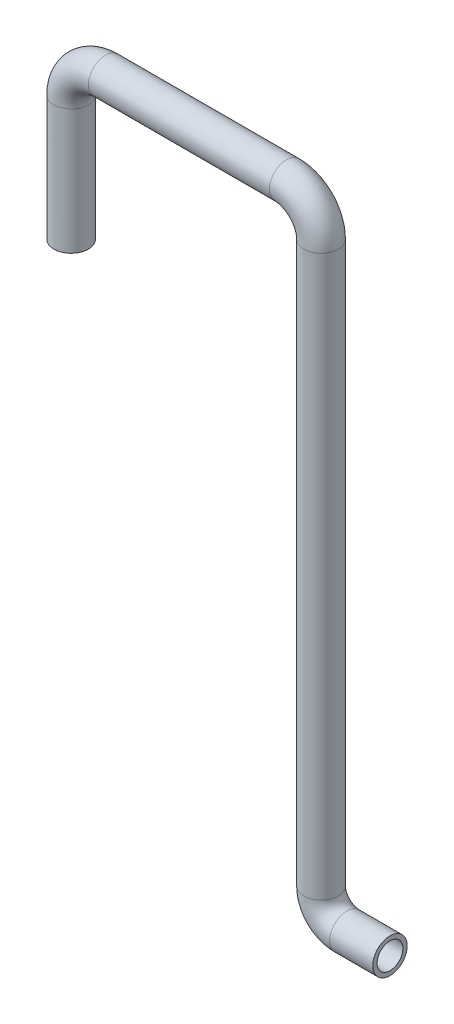
ISO-10303-21;
HEADER;
FILE_DESCRIPTION(('STEP AP214'),'2;1');
FILE_NAME('part.step','',(''),(''),'','','');
FILE_SCHEMA(('AUTOMOTIVE_DESIGN { 1 0 10303 214 1 1 1 1 }'));
ENDSEC;
DATA;
#1=APPLICATION_CONTEXT('core data for automotive mechanical design processes');
#2=APPLICATION_PROTOCOL_DEFINITION('international standard','automotive_design',2000,#1);
#3=PRODUCT_CONTEXT('',#1,'mechanical');
#4=PRODUCT('Part','Part','',(#3));
#5=PRODUCT_RELATED_PRODUCT_CATEGORY('part','',(#4));
#6=PRODUCT_DEFINITION_FORMATION('','',#4);
#7=PRODUCT_DEFINITION_CONTEXT('part definition',#1,'design');
#8=PRODUCT_DEFINITION('design','',#6,#7);
#9=PRODUCT_DEFINITION_SHAPE('','',#8);
#10=(LENGTH_UNIT() NAMED_UNIT(*) SI_UNIT(.MILLI.,.METRE.));
#11=(NAMED_UNIT(*) PLANE_ANGLE_UNIT() SI_UNIT($,.RADIAN.));
#12=(NAMED_UNIT(*) SI_UNIT($,.STERADIAN.) SOLID_ANGLE_UNIT());
#13=UNCERTAINTY_MEASURE_WITH_UNIT(LENGTH_MEASURE(1.E-05),#10,'distance_accuracy_value','');
#14=(GEOMETRIC_REPRESENTATION_CONTEXT(3) GLOBAL_UNCERTAINTY_ASSIGNED_CONTEXT((#13)) GLOBAL_UNIT_ASSIGNED_CONTEXT((#10,
#11,#12)) REPRESENTATION_CONTEXT('',''));
#15=CARTESIAN_POINT('',(0.,0.,0.));
#16=DIRECTION('',(0.,0.,1.));
#17=DIRECTION('',(1.,0.,0.));
#18=AXIS2_PLACEMENT_3D('',#15,#16,#17);
#19=CARTESIAN_POINT('',(14.,128.,95.));
#20=DIRECTION('',(0.,-1.,0.));
#21=DIRECTION('',(0.,0.,1.));
#22=AXIS2_PLACEMENT_3D('',#19,#20,#21);
#23=PLANE('',#22);
#24=CARTESIAN_POINT('',(14.,128.,95.));
#25=DIRECTION('',(0.,-1.,0.));
#26=DIRECTION('',(0.,0.,1.));
#27=AXIS2_PLACEMENT_3D('',#24,#25,#26);
#28=CIRCLE('',#27,3.);
#29=CARTESIAN_POINT('',(14.,128.,98.));
#30=VERTEX_POINT('',#29);
#31=EDGE_CURVE('E263',#30,#30,#28,.T.);
#32=ORIENTED_EDGE('',*,*,#31,.F.);
#33=EDGE_LOOP('',(#32));
#34=FACE_BOUND('',#33,.T.);
#35=CARTESIAN_POINT('',(14.,128.,95.));
#36=DIRECTION('',(0.,-1.,0.));
#37=DIRECTION('',(1.,0.,0.));
#38=AXIS2_PLACEMENT_3D('',#35,#36,#37);
#39=CIRCLE('',#38,4.);
#40=CARTESIAN_POINT('',(18.,128.,95.));
#41=VERTEX_POINT('',#40);
#42=EDGE_CURVE('E75',#41,#41,#39,.T.);
#43=ORIENTED_EDGE('',*,*,#42,.T.);
#44=EDGE_LOOP('',(#43));
#45=FACE_BOUND('',#44,.T.);
#46=ADVANCED_FACE('F52',(#34,#45),#23,.T.);
#47=CARTESIAN_POINT('',(88.,21.,95.));
#48=DIRECTION('',(-1.,0.,0.));
#49=DIRECTION('',(0.,0.,1.));
#50=AXIS2_PLACEMENT_3D('',#47,#48,#49);
#51=PLANE('',#50);
#52=CARTESIAN_POINT('',(88.,21.,95.));
#53=DIRECTION('',(-1.,0.,0.));
#54=DIRECTION('',(0.,0.,1.));
#55=AXIS2_PLACEMENT_3D('',#52,#53,#54);
#56=CIRCLE('',#55,3.);
#57=CARTESIAN_POINT('',(88.,21.,98.));
#58=VERTEX_POINT('',#57);
#59=EDGE_CURVE('E73',#58,#58,#56,.T.);
#60=ORIENTED_EDGE('',*,*,#59,.T.);
#61=EDGE_LOOP('',(#60));
#62=FACE_BOUND('',#61,.T.);
#63=CARTESIAN_POINT('',(88.,21.,95.));
#64=DIRECTION('',(-1.,0.,0.));
#65=DIRECTION('',(0.,0.,1.));
#66=AXIS2_PLACEMENT_3D('',#63,#64,#65);
#67=CIRCLE('',#66,4.);
#68=CARTESIAN_POINT('',(88.,21.,99.));
#69=VERTEX_POINT('',#68);
#70=EDGE_CURVE('E11',#69,#69,#67,.T.);
#71=ORIENTED_EDGE('',*,*,#70,.F.);
#72=EDGE_LOOP('',(#71));
#73=FACE_BOUND('',#72,.T.);
#74=ADVANCED_FACE('F149',(#62,#73),#51,.F.);
#75=CARTESIAN_POINT('',(14.,128.,95.));
#76=DIRECTION('',(0.,1.,0.));
#77=DIRECTION('',(-1.,0.,0.));
#78=AXIS2_PLACEMENT_3D('',#75,#76,#77);
#79=CYLINDRICAL_SURFACE('',#78,4.);
#80=CARTESIAN_POINT('',(14.,157.,95.));
#81=DIRECTION('',(0.,1.,0.));
#82=DIRECTION('',(-1.,0.,0.));
#83=AXIS2_PLACEMENT_3D('',#80,#81,#82);
#84=CIRCLE('',#83,4.);
#85=CARTESIAN_POINT('',(9.99999999999999,157.,95.));
#86=VERTEX_POINT('',#85);
#87=EDGE_CURVE('E74',#86,#86,#84,.F.);
#88=ORIENTED_EDGE('',*,*,#87,.T.);
#89=EDGE_LOOP('',(#88));
#90=FACE_BOUND('',#89,.T.);
#91=ORIENTED_EDGE('',*,*,#42,.F.);
#92=EDGE_LOOP('',(#91));
#93=FACE_BOUND('',#92,.T.);
#94=ADVANCED_FACE('F155',(#90,#93),#79,.T.);
#95=CARTESIAN_POINT('',(22.,157.,95.));
#96=DIRECTION('',(0.,0.,-1.));
#97=DIRECTION('',(-1.,0.,0.));
#98=AXIS2_PLACEMENT_3D('',#95,#96,#97);
#99=TOROIDAL_SURFACE('',#98,8.,4.);
#100=CARTESIAN_POINT('',(22.,165.,95.));
#101=DIRECTION('',(-1.,0.,0.));
#102=DIRECTION('',(0.,-1.,0.));
#103=AXIS2_PLACEMENT_3D('',#100,#101,#102);
#104=CIRCLE('',#103,4.);
#105=CARTESIAN_POINT('',(22.,169.,95.));
#106=VERTEX_POINT('',#105);
#107=EDGE_CURVE('E78',#106,#106,#104,.T.);
#108=CARTESIAN_POINT('',(22.,157.,95.));
#109=DIRECTION('',(0.,0.,-1.));
#110=DIRECTION('',(-1.,0.,0.));
#111=AXIS2_PLACEMENT_3D('',#108,#109,#110);
#112=CIRCLE('',#111,12.);
#113=EDGE_CURVE('',#86,#106,#112,.T.);
#114=ORIENTED_EDGE('',*,*,#87,.F.);
#115=ORIENTED_EDGE('',*,*,#107,.T.);
#116=ORIENTED_EDGE('',*,*,#113,.T.);
#117=ORIENTED_EDGE('',*,*,#113,.F.);
#118=EDGE_LOOP('',(#114,#116,#115,#117));
#119=FACE_BOUND('',#118,.T.);
#120=ADVANCED_FACE('F158',(#119),#99,.T.);
#121=CARTESIAN_POINT('',(22.,165.,95.));
#122=DIRECTION('',(1.,0.,0.));
#123=DIRECTION('',(0.,0.,-1.));
#124=AXIS2_PLACEMENT_3D('',#121,#122,#123);
#125=CYLINDRICAL_SURFACE('',#124,4.);
#126=CARTESIAN_POINT('',(64.,165.,95.));
#127=DIRECTION('',(1.,0.,0.));
#128=DIRECTION('',(0.,0.,-1.));
#129=AXIS2_PLACEMENT_3D('',#126,#127,#128);
#130=CIRCLE('',#129,4.);
#131=CARTESIAN_POINT('',(64.,169.,95.));
#132=VERTEX_POINT('',#131);
#133=EDGE_CURVE('E91',#132,#132,#130,.F.);
#134=ORIENTED_EDGE('',*,*,#133,.T.);
#135=EDGE_LOOP('',(#134));
#136=FACE_BOUND('',#135,.T.);
#137=ORIENTED_EDGE('',*,*,#107,.F.);
#138=EDGE_LOOP('',(#137));
#139=FACE_BOUND('',#138,.T.);
#140=ADVANCED_FACE('F109',(#136,#139),#125,.T.);
#141=CARTESIAN_POINT('',(64.,157.,95.));
#142=DIRECTION('',(0.,0.,-1.));
#143=DIRECTION('',(-1.,0.,0.));
#144=AXIS2_PLACEMENT_3D('',#141,#142,#143);
#145=TOROIDAL_SURFACE('',#144,8.00000000000001,4.);
#146=CARTESIAN_POINT('',(72.,157.,95.));
#147=DIRECTION('',(0.,1.,0.));
#148=DIRECTION('',(-1.,0.,0.));
#149=AXIS2_PLACEMENT_3D('',#146,#147,#148);
#150=CIRCLE('',#149,4.);
#151=CARTESIAN_POINT('',(76.,157.,95.));
#152=VERTEX_POINT('',#151);
#153=EDGE_CURVE('E68',#152,#152,#150,.T.);
#154=CARTESIAN_POINT('',(64.,157.,95.));
#155=DIRECTION('',(0.,0.,-1.));
#156=DIRECTION('',(-1.,0.,0.));
#157=AXIS2_PLACEMENT_3D('',#154,#155,#156);
#158=CIRCLE('',#157,12.);
#159=EDGE_CURVE('',#132,#152,#158,.T.);
#160=ORIENTED_EDGE('',*,*,#133,.F.);
#161=ORIENTED_EDGE('',*,*,#153,.T.);
#162=ORIENTED_EDGE('',*,*,#159,.T.);
#163=ORIENTED_EDGE('',*,*,#159,.F.);
#164=EDGE_LOOP('',(#160,#162,#161,#163));
#165=FACE_BOUND('',#164,.T.);
#166=ADVANCED_FACE('F98',(#165),#145,.T.);
#167=CARTESIAN_POINT('',(72.,157.,95.));
#168=DIRECTION('',(0.,-1.,0.));
#169=DIRECTION('',(0.,0.,-1.));
#170=AXIS2_PLACEMENT_3D('',#167,#168,#169);
#171=CYLINDRICAL_SURFACE('',#170,4.);
#172=CARTESIAN_POINT('',(72.,27.,95.));
#173=DIRECTION('',(0.,-1.,0.));
#174=DIRECTION('',(0.,0.,-1.));
#175=AXIS2_PLACEMENT_3D('',#172,#173,#174);
#176=CIRCLE('',#175,4.);
#177=CARTESIAN_POINT('',(68.,27.,95.));
#178=VERTEX_POINT('',#177);
#179=EDGE_CURVE('E63',#178,#178,#176,.F.);
#180=ORIENTED_EDGE('',*,*,#179,.T.);
#181=EDGE_LOOP('',(#180));
#182=FACE_BOUND('',#181,.T.);
#183=ORIENTED_EDGE('',*,*,#153,.F.);
#184=EDGE_LOOP('',(#183));
#185=FACE_BOUND('',#184,.T.);
#186=ADVANCED_FACE('F101',(#182,#185),#171,.T.);
#187=CARTESIAN_POINT('',(78.,27.,95.));
#188=DIRECTION('',(0.,0.,1.));
#189=DIRECTION('',(1.,0.,0.));
#190=AXIS2_PLACEMENT_3D('',#187,#188,#189);
#191=TOROIDAL_SURFACE('',#190,6.00000000000001,4.);
#192=CARTESIAN_POINT('',(78.,21.,95.));
#193=DIRECTION('',(-1.,0.,0.));
#194=DIRECTION('',(0.,-1.,0.));
#195=AXIS2_PLACEMENT_3D('',#192,#193,#194);
#196=CIRCLE('',#195,4.);
#197=CARTESIAN_POINT('',(77.9999999999999,17.,95.));
#198=VERTEX_POINT('',#197);
#199=EDGE_CURVE('E58',#198,#198,#196,.T.);
#200=CARTESIAN_POINT('',(78.,27.,95.));
#201=DIRECTION('',(0.,0.,1.));
#202=DIRECTION('',(1.,0.,0.));
#203=AXIS2_PLACEMENT_3D('',#200,#201,#202);
#204=CIRCLE('',#203,10.);
#205=EDGE_CURVE('',#178,#198,#204,.T.);
#206=ORIENTED_EDGE('',*,*,#179,.F.);
#207=ORIENTED_EDGE('',*,*,#199,.T.);
#208=ORIENTED_EDGE('',*,*,#205,.T.);
#209=ORIENTED_EDGE('',*,*,#205,.F.);
#210=EDGE_LOOP('',(#206,#208,#207,#209));
#211=FACE_BOUND('',#210,.T.);
#212=ADVANCED_FACE('F103',(#211),#191,.T.);
#213=CARTESIAN_POINT('',(78.,21.,95.));
#214=DIRECTION('',(1.,0.,0.));
#215=DIRECTION('',(0.,0.,-1.));
#216=AXIS2_PLACEMENT_3D('',#213,#214,#215);
#217=CYLINDRICAL_SURFACE('',#216,4.);
#218=ORIENTED_EDGE('',*,*,#70,.T.);
#219=EDGE_LOOP('',(#218));
#220=FACE_BOUND('',#219,.T.);
#221=ORIENTED_EDGE('',*,*,#199,.F.);
#222=EDGE_LOOP('',(#221));
#223=FACE_BOUND('',#222,.T.);
#224=ADVANCED_FACE('F54',(#220,#223),#217,.T.);
#225=CARTESIAN_POINT('',(14.,128.,95.));
#226=DIRECTION('',(0.,1.,0.));
#227=DIRECTION('',(-1.,0.,0.));
#228=AXIS2_PLACEMENT_3D('',#225,#226,#227);
#229=CYLINDRICAL_SURFACE('',#228,3.);
#230=CARTESIAN_POINT('',(14.,157.,95.));
#231=DIRECTION('',(0.,-1.,0.));
#232=DIRECTION('',(0.,0.,1.));
#233=AXIS2_PLACEMENT_3D('',#230,#231,#232);
#234=CIRCLE('',#233,3.);
#235=CARTESIAN_POINT('',(11.,157.,95.));
#236=VERTEX_POINT('',#235);
#237=EDGE_CURVE('E262',#236,#236,#234,.T.);
#238=ORIENTED_EDGE('',*,*,#237,.F.);
#239=EDGE_LOOP('',(#238));
#240=FACE_BOUND('',#239,.T.);
#241=ORIENTED_EDGE('',*,*,#31,.T.);
#242=EDGE_LOOP('',(#241));
#243=FACE_BOUND('',#242,.T.);
#244=ADVANCED_FACE('F114',(#240,#243),#229,.F.);
#245=CARTESIAN_POINT('',(22.,157.,95.));
#246=DIRECTION('',(0.,0.,-1.));
#247=DIRECTION('',(-1.,0.,0.));
#248=AXIS2_PLACEMENT_3D('',#245,#246,#247);
#249=TOROIDAL_SURFACE('',#248,8.,3.);
#250=CARTESIAN_POINT('',(22.,165.,95.));
#251=DIRECTION('',(-1.,0.,0.));
#252=DIRECTION('',(0.,0.,1.));
#253=AXIS2_PLACEMENT_3D('',#250,#251,#252);
#254=CIRCLE('',#253,3.);
#255=CARTESIAN_POINT('',(22.,168.,95.));
#256=VERTEX_POINT('',#255);
#257=EDGE_CURVE('E270',#256,#256,#254,.T.);
#258=CARTESIAN_POINT('',(22.,157.,95.));
#259=DIRECTION('',(0.,0.,-1.));
#260=DIRECTION('',(-1.,0.,0.));
#261=AXIS2_PLACEMENT_3D('',#258,#259,#260);
#262=CIRCLE('',#261,11.);
#263=EDGE_CURVE('',#236,#256,#262,.T.);
#264=ORIENTED_EDGE('',*,*,#237,.T.);
#265=ORIENTED_EDGE('',*,*,#257,.F.);
#266=ORIENTED_EDGE('',*,*,#263,.T.);
#267=ORIENTED_EDGE('',*,*,#263,.F.);
#268=EDGE_LOOP('',(#264,#266,#265,#267));
#269=FACE_BOUND('',#268,.T.);
#270=ADVANCED_FACE('F116',(#269),#249,.F.);
#271=CARTESIAN_POINT('',(22.,165.,95.));
#272=DIRECTION('',(1.,0.,0.));
#273=DIRECTION('',(0.,0.,-1.));
#274=AXIS2_PLACEMENT_3D('',#271,#272,#273);
#275=CYLINDRICAL_SURFACE('',#274,3.);
#276=CARTESIAN_POINT('',(64.,165.,95.));
#277=DIRECTION('',(-1.,0.,0.));
#278=DIRECTION('',(0.,0.,1.));
#279=AXIS2_PLACEMENT_3D('',#276,#277,#278);
#280=CIRCLE('',#279,3.);
#281=CARTESIAN_POINT('',(64.,168.,95.));
#282=VERTEX_POINT('',#281);
#283=EDGE_CURVE('E275',#282,#282,#280,.T.);
#284=ORIENTED_EDGE('',*,*,#283,.F.);
#285=EDGE_LOOP('',(#284));
#286=FACE_BOUND('',#285,.T.);
#287=ORIENTED_EDGE('',*,*,#257,.T.);
#288=EDGE_LOOP('',(#287));
#289=FACE_BOUND('',#288,.T.);
#290=ADVANCED_FACE('F123',(#286,#289),#275,.F.);
#291=CARTESIAN_POINT('',(64.,157.,95.));
#292=DIRECTION('',(0.,0.,-1.));
#293=DIRECTION('',(-1.,0.,0.));
#294=AXIS2_PLACEMENT_3D('',#291,#292,#293);
#295=TOROIDAL_SURFACE('',#294,8.00000000000001,3.);
#296=CARTESIAN_POINT('',(72.,157.,95.));
#297=DIRECTION('',(0.,1.,0.));
#298=DIRECTION('',(0.,0.,1.));
#299=AXIS2_PLACEMENT_3D('',#296,#297,#298);
#300=CIRCLE('',#299,3.);
#301=CARTESIAN_POINT('',(75.,157.,95.));
#302=VERTEX_POINT('',#301);
#303=EDGE_CURVE('E274',#302,#302,#300,.T.);
#304=CARTESIAN_POINT('',(64.,157.,95.));
#305=DIRECTION('',(0.,0.,-1.));
#306=DIRECTION('',(-1.,0.,0.));
#307=AXIS2_PLACEMENT_3D('',#304,#305,#306);
#308=CIRCLE('',#307,11.);
#309=EDGE_CURVE('',#282,#302,#308,.T.);
#310=ORIENTED_EDGE('',*,*,#283,.T.);
#311=ORIENTED_EDGE('',*,*,#303,.F.);
#312=ORIENTED_EDGE('',*,*,#309,.T.);
#313=ORIENTED_EDGE('',*,*,#309,.F.);
#314=EDGE_LOOP('',(#310,#312,#311,#313));
#315=FACE_BOUND('',#314,.T.);
#316=ADVANCED_FACE('F131',(#315),#295,.F.);
#317=CARTESIAN_POINT('',(72.,157.,95.));
#318=DIRECTION('',(0.,-1.,0.));
#319=DIRECTION('',(0.,0.,-1.));
#320=AXIS2_PLACEMENT_3D('',#317,#318,#319);
#321=CYLINDRICAL_SURFACE('',#320,3.);
#322=CARTESIAN_POINT('',(72.,27.,95.));
#323=DIRECTION('',(0.,1.,0.));
#324=DIRECTION('',(0.,0.,1.));
#325=AXIS2_PLACEMENT_3D('',#322,#323,#324);
#326=CIRCLE('',#325,3.);
#327=CARTESIAN_POINT('',(69.,27.,95.));
#328=VERTEX_POINT('',#327);
#329=EDGE_CURVE('E87',#328,#328,#326,.T.);
#330=ORIENTED_EDGE('',*,*,#329,.F.);
#331=EDGE_LOOP('',(#330));
#332=FACE_BOUND('',#331,.T.);
#333=ORIENTED_EDGE('',*,*,#303,.T.);
#334=EDGE_LOOP('',(#333));
#335=FACE_BOUND('',#334,.T.);
#336=ADVANCED_FACE('F136',(#332,#335),#321,.F.);
#337=CARTESIAN_POINT('',(78.,27.,95.));
#338=DIRECTION('',(0.,0.,1.));
#339=DIRECTION('',(1.,0.,0.));
#340=AXIS2_PLACEMENT_3D('',#337,#338,#339);
#341=TOROIDAL_SURFACE('',#340,6.00000000000001,3.);
#342=CARTESIAN_POINT('',(78.,21.0000000000002,95.));
#343=DIRECTION('',(-1.,0.,0.));
#344=DIRECTION('',(0.,0.,1.));
#345=AXIS2_PLACEMENT_3D('',#342,#343,#344);
#346=CIRCLE('',#345,3.);
#347=CARTESIAN_POINT('',(77.9999999999999,18.,95.));
#348=VERTEX_POINT('',#347);
#349=EDGE_CURVE('E85',#348,#348,#346,.T.);
#350=CARTESIAN_POINT('',(78.,27.,95.));
#351=DIRECTION('',(0.,0.,1.));
#352=DIRECTION('',(1.,0.,0.));
#353=AXIS2_PLACEMENT_3D('',#350,#351,#352);
#354=CIRCLE('',#353,9.00000000000001);
#355=EDGE_CURVE('',#328,#348,#354,.T.);
#356=ORIENTED_EDGE('',*,*,#329,.T.);
#357=ORIENTED_EDGE('',*,*,#349,.F.);
#358=ORIENTED_EDGE('',*,*,#355,.T.);
#359=ORIENTED_EDGE('',*,*,#355,.F.);
#360=EDGE_LOOP('',(#356,#358,#357,#359));
#361=FACE_BOUND('',#360,.T.);
#362=ADVANCED_FACE('F139',(#361),#341,.F.);
#363=CARTESIAN_POINT('',(78.,21.,95.));
#364=DIRECTION('',(1.,0.,0.));
#365=DIRECTION('',(0.,0.,-1.));
#366=AXIS2_PLACEMENT_3D('',#363,#364,#365);
#367=CYLINDRICAL_SURFACE('',#366,3.);
#368=ORIENTED_EDGE('',*,*,#59,.F.);
#369=EDGE_LOOP('',(#368));
#370=FACE_BOUND('',#369,.T.);
#371=ORIENTED_EDGE('',*,*,#349,.T.);
#372=EDGE_LOOP('',(#371));
#373=FACE_BOUND('',#372,.T.);
#374=ADVANCED_FACE('F145',(#370,#373),#367,.F.);
#375=CLOSED_SHELL('',(#46,#74,#94,#120,#140,#166,#186,#212,#224,#244,#270,#290,#316,#336,#362,#374));
#376=MANIFOLD_SOLID_BREP('B2',#375);
#377=ADVANCED_BREP_SHAPE_REPRESENTATION('',(#18,#376),#14);
#378=SHAPE_DEFINITION_REPRESENTATION(#9,#377);
ENDSEC;
END-ISO-10303-21;
